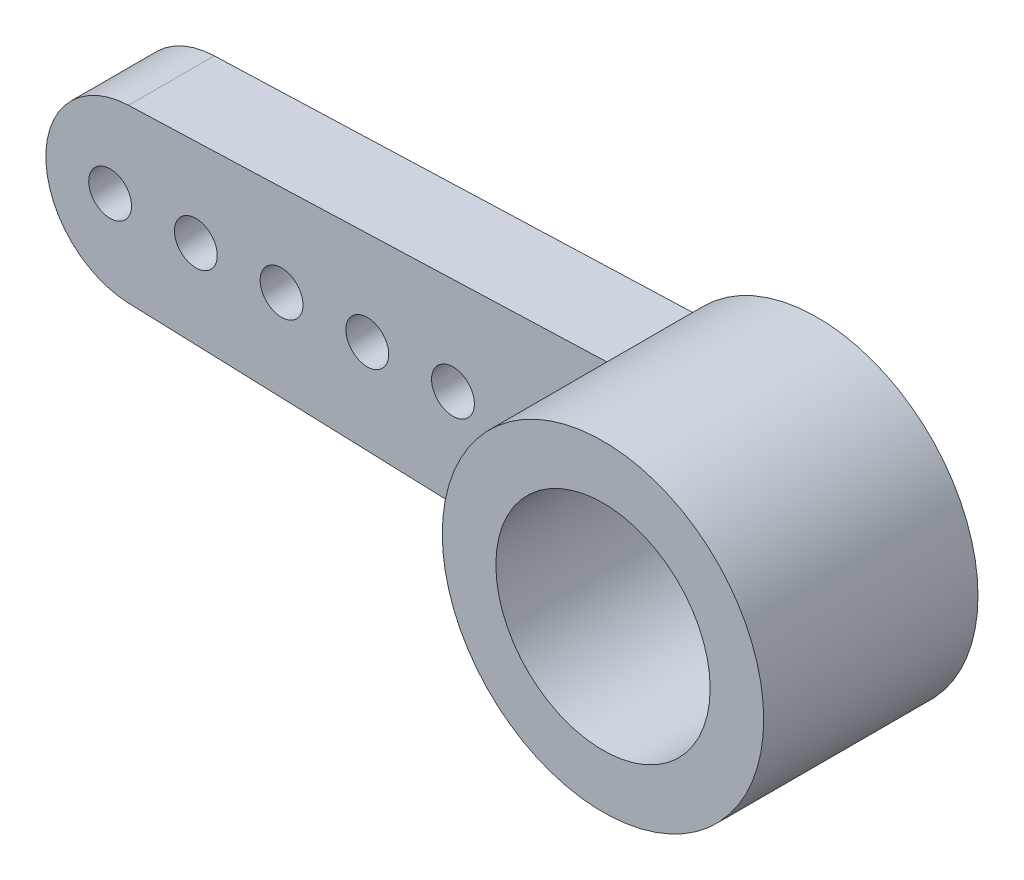
ISO-10303-21;
HEADER;
FILE_DESCRIPTION(('STEP AP214'),'2;1');
FILE_NAME('part.step','',(''),(''),'','','');
FILE_SCHEMA(('AUTOMOTIVE_DESIGN { 1 0 10303 214 1 1 1 1 }'));
ENDSEC;
DATA;
#1=APPLICATION_CONTEXT('core data for automotive mechanical design processes');
#2=APPLICATION_PROTOCOL_DEFINITION('international standard','automotive_design',2000,#1);
#3=PRODUCT_CONTEXT('',#1,'mechanical');
#4=PRODUCT('Part','Part','',(#3));
#5=PRODUCT_RELATED_PRODUCT_CATEGORY('part','',(#4));
#6=PRODUCT_DEFINITION_FORMATION('','',#4);
#7=PRODUCT_DEFINITION_CONTEXT('part definition',#1,'design');
#8=PRODUCT_DEFINITION('design','',#6,#7);
#9=PRODUCT_DEFINITION_SHAPE('','',#8);
#10=(LENGTH_UNIT() NAMED_UNIT(*) SI_UNIT(.MILLI.,.METRE.));
#11=(NAMED_UNIT(*) PLANE_ANGLE_UNIT() SI_UNIT($,.RADIAN.));
#12=(NAMED_UNIT(*) SI_UNIT($,.STERADIAN.) SOLID_ANGLE_UNIT());
#13=UNCERTAINTY_MEASURE_WITH_UNIT(LENGTH_MEASURE(1.E-05),#10,'distance_accuracy_value','');
#14=(GEOMETRIC_REPRESENTATION_CONTEXT(3) GLOBAL_UNCERTAINTY_ASSIGNED_CONTEXT((#13)) GLOBAL_UNIT_ASSIGNED_CONTEXT((#10,
#11,#12)) REPRESENTATION_CONTEXT('',''));
#15=CARTESIAN_POINT('',(0.,0.,0.));
#16=DIRECTION('',(0.,0.,1.));
#17=DIRECTION('',(1.,0.,0.));
#18=AXIS2_PLACEMENT_3D('',#15,#16,#17);
#19=CARTESIAN_POINT('',(0.,0.,0.));
#20=DIRECTION('',(0.,0.,1.));
#21=DIRECTION('',(1.,0.,0.));
#22=AXIS2_PLACEMENT_3D('',#19,#20,#21);
#23=PLANE('',#22);
#24=CARTESIAN_POINT('',(-14.5,0.,0.));
#25=DIRECTION('',(0.,0.,-1.));
#26=DIRECTION('',(-1.,0.,0.));
#27=AXIS2_PLACEMENT_3D('',#24,#25,#26);
#28=CIRCLE('',#27,0.500000000000001);
#29=CARTESIAN_POINT('',(-15.,0.,0.));
#30=VERTEX_POINT('',#29);
#31=EDGE_CURVE('E164',#30,#30,#28,.F.);
#32=ORIENTED_EDGE('',*,*,#31,.T.);
#33=EDGE_LOOP('',(#32));
#34=FACE_BOUND('',#33,.T.);
#35=CARTESIAN_POINT('',(-10.5,0.,0.));
#36=DIRECTION('',(0.,0.,-1.));
#37=DIRECTION('',(-1.,0.,0.));
#38=AXIS2_PLACEMENT_3D('',#35,#36,#37);
#39=CIRCLE('',#38,0.500000000000001);
#40=CARTESIAN_POINT('',(-11.,0.,0.));
#41=VERTEX_POINT('',#40);
#42=EDGE_CURVE('E152',#41,#41,#39,.F.);
#43=ORIENTED_EDGE('',*,*,#42,.T.);
#44=EDGE_LOOP('',(#43));
#45=FACE_BOUND('',#44,.T.);
#46=CARTESIAN_POINT('',(-6.5,0.,0.));
#47=DIRECTION('',(0.,0.,-1.));
#48=DIRECTION('',(-1.,0.,0.));
#49=AXIS2_PLACEMENT_3D('',#46,#47,#48);
#50=CIRCLE('',#49,0.500000000000001);
#51=CARTESIAN_POINT('',(-7.,0.,0.));
#52=VERTEX_POINT('',#51);
#53=EDGE_CURVE('E140',#52,#52,#50,.F.);
#54=ORIENTED_EDGE('',*,*,#53,.T.);
#55=EDGE_LOOP('',(#54));
#56=FACE_BOUND('',#55,.T.);
#57=CARTESIAN_POINT('',(-4.5,0.,0.));
#58=DIRECTION('',(0.,0.,-1.));
#59=DIRECTION('',(-1.,0.,0.));
#60=AXIS2_PLACEMENT_3D('',#57,#58,#59);
#61=CIRCLE('',#60,0.500000000000001);
#62=CARTESIAN_POINT('',(-5.,0.,0.));
#63=VERTEX_POINT('',#62);
#64=EDGE_CURVE('E136',#63,#63,#61,.F.);
#65=ORIENTED_EDGE('',*,*,#64,.T.);
#66=EDGE_LOOP('',(#65));
#67=FACE_BOUND('',#66,.T.);
#68=CARTESIAN_POINT('',(-8.5,0.,0.));
#69=DIRECTION('',(0.,0.,-1.));
#70=DIRECTION('',(-1.,0.,0.));
#71=AXIS2_PLACEMENT_3D('',#68,#69,#70);
#72=CIRCLE('',#71,0.500000000000001);
#73=CARTESIAN_POINT('',(-9.,0.,0.));
#74=VERTEX_POINT('',#73);
#75=EDGE_CURVE('E146',#74,#74,#72,.F.);
#76=ORIENTED_EDGE('',*,*,#75,.T.);
#77=EDGE_LOOP('',(#76));
#78=FACE_BOUND('',#77,.T.);
#79=CARTESIAN_POINT('',(-12.5,0.,0.));
#80=DIRECTION('',(0.,0.,-1.));
#81=DIRECTION('',(-1.,0.,0.));
#82=AXIS2_PLACEMENT_3D('',#79,#80,#81);
#83=CIRCLE('',#82,0.500000000000001);
#84=CARTESIAN_POINT('',(-13.,0.,0.));
#85=VERTEX_POINT('',#84);
#86=EDGE_CURVE('E158',#85,#85,#83,.F.);
#87=ORIENTED_EDGE('',*,*,#86,.T.);
#88=EDGE_LOOP('',(#87));
#89=FACE_BOUND('',#88,.T.);
#90=CARTESIAN_POINT('',(0.,0.,0.));
#91=DIRECTION('',(0.,0.,-1.));
#92=DIRECTION('',(-1.,0.,0.));
#93=AXIS2_PLACEMENT_3D('',#90,#91,#92);
#94=CIRCLE('',#93,2.5);
#95=CARTESIAN_POINT('',(-2.5,0.,0.));
#96=VERTEX_POINT('',#95);
#97=EDGE_CURVE('E176',#96,#96,#94,.T.);
#98=ORIENTED_EDGE('',*,*,#97,.F.);
#99=EDGE_LOOP('',(#98));
#100=FACE_BOUND('',#99,.T.);
#101=DIRECTION('',(0.999372730394994,0.0354139201848026,0.));
#102=VECTOR('',#101,1.);
#103=CARTESIAN_POINT('',(-0.0883858807695831,2.49422934631706,0.));
#104=LINE('',#103,#102);
#105=CARTESIAN_POINT('',(-14.0708278403696,1.99874546078999,0.));
#106=VERTEX_POINT('',#105);
#107=CARTESIAN_POINT('',(-2.88547071027724,2.39511143376089,0.));
#108=VERTEX_POINT('',#107);
#109=EDGE_CURVE('E124',#106,#108,#104,.T.);
#110=ORIENTED_EDGE('',*,*,#109,.T.);
#111=CARTESIAN_POINT('',(0.,0.,0.));
#112=DIRECTION('',(0.,0.,-1.));
#113=DIRECTION('',(-1.,0.,0.));
#114=AXIS2_PLACEMENT_3D('',#111,#112,#113);
#115=CIRCLE('',#114,3.75);
#116=CARTESIAN_POINT('',(-2.88547071027724,-2.39511143376089,0.));
#117=VERTEX_POINT('',#116);
#118=EDGE_CURVE('E53',#108,#117,#115,.T.);
#119=ORIENTED_EDGE('',*,*,#118,.T.);
#120=DIRECTION('',(0.999372730394994,-0.0354139201848024,0.));
#121=VECTOR('',#120,1.);
#122=CARTESIAN_POINT('',(-0.0883858807695825,-2.49422934631706,0.));
#123=LINE('',#122,#121);
#124=CARTESIAN_POINT('',(-14.0708278403696,-1.99874546078999,0.));
#125=VERTEX_POINT('',#124);
#126=EDGE_CURVE('E105',#125,#117,#123,.T.);
#127=ORIENTED_EDGE('',*,*,#126,.F.);
#128=CARTESIAN_POINT('',(-14.,0.,0.));
#129=DIRECTION('',(0.,0.,1.));
#130=DIRECTION('',(1.,0.,0.));
#131=AXIS2_PLACEMENT_3D('',#128,#129,#130);
#132=CIRCLE('',#131,2.);
#133=EDGE_CURVE('E127',#125,#106,#132,.F.);
#134=ORIENTED_EDGE('',*,*,#133,.T.);
#135=EDGE_LOOP('',(#110,#119,#127,#134));
#136=FACE_BOUND('',#135,.T.);
#137=ADVANCED_FACE('F45',(#34,#45,#56,#67,#78,#89,#100,#136),#23,.F.);
#138=CARTESIAN_POINT('',(0.,0.,0.));
#139=DIRECTION('',(0.,0.,1.));
#140=DIRECTION('',(1.,0.,0.));
#141=AXIS2_PLACEMENT_3D('',#138,#139,#140);
#142=CYLINDRICAL_SURFACE('',#141,2.5);
#143=CARTESIAN_POINT('',(0.,0.,5.));
#144=DIRECTION('',(0.,0.,1.));
#145=DIRECTION('',(1.,0.,0.));
#146=AXIS2_PLACEMENT_3D('',#143,#144,#145);
#147=CIRCLE('',#146,2.5);
#148=CARTESIAN_POINT('',(2.5,0.,5.));
#149=VERTEX_POINT('',#148);
#150=EDGE_CURVE('E133',#149,#149,#147,.T.);
#151=ORIENTED_EDGE('',*,*,#150,.T.);
#152=EDGE_LOOP('',(#151));
#153=FACE_BOUND('',#152,.T.);
#154=CARTESIAN_POINT('',(0.,0.,1.));
#155=DIRECTION('',(0.,0.,-1.));
#156=DIRECTION('',(-1.,0.,0.));
#157=AXIS2_PLACEMENT_3D('',#154,#155,#156);
#158=CIRCLE('',#157,2.5);
#159=CARTESIAN_POINT('',(-2.5,0.,1.));
#160=VERTEX_POINT('',#159);
#161=EDGE_CURVE('E170',#160,#160,#158,.T.);
#162=ORIENTED_EDGE('',*,*,#161,.T.);
#163=EDGE_LOOP('',(#162));
#164=FACE_BOUND('',#163,.T.);
#165=ADVANCED_FACE('F206',(#153,#164),#142,.F.);
#166=CARTESIAN_POINT('',(0.,0.,2.));
#167=DIRECTION('',(0.,0.,1.));
#168=DIRECTION('',(1.,0.,0.));
#169=AXIS2_PLACEMENT_3D('',#166,#167,#168);
#170=PLANE('',#169);
#171=CARTESIAN_POINT('',(-12.5,0.,2.));
#172=DIRECTION('',(0.,0.,-1.));
#173=DIRECTION('',(-1.,0.,0.));
#174=AXIS2_PLACEMENT_3D('',#171,#172,#173);
#175=CIRCLE('',#174,0.500000000000001);
#176=CARTESIAN_POINT('',(-13.,0.,2.));
#177=VERTEX_POINT('',#176);
#178=EDGE_CURVE('E161',#177,#177,#175,.F.);
#179=ORIENTED_EDGE('',*,*,#178,.F.);
#180=EDGE_LOOP('',(#179));
#181=FACE_BOUND('',#180,.T.);
#182=CARTESIAN_POINT('',(-8.5,0.,2.));
#183=DIRECTION('',(0.,0.,-1.));
#184=DIRECTION('',(-1.,0.,0.));
#185=AXIS2_PLACEMENT_3D('',#182,#183,#184);
#186=CIRCLE('',#185,0.500000000000001);
#187=CARTESIAN_POINT('',(-9.,0.,2.));
#188=VERTEX_POINT('',#187);
#189=EDGE_CURVE('E149',#188,#188,#186,.F.);
#190=ORIENTED_EDGE('',*,*,#189,.F.);
#191=EDGE_LOOP('',(#190));
#192=FACE_BOUND('',#191,.T.);
#193=CARTESIAN_POINT('',(-4.5,0.,2.));
#194=DIRECTION('',(0.,0.,-1.));
#195=DIRECTION('',(-1.,0.,0.));
#196=AXIS2_PLACEMENT_3D('',#193,#194,#195);
#197=CIRCLE('',#196,0.500000000000001);
#198=CARTESIAN_POINT('',(-5.,0.,2.));
#199=VERTEX_POINT('',#198);
#200=EDGE_CURVE('E137',#199,#199,#197,.F.);
#201=ORIENTED_EDGE('',*,*,#200,.F.);
#202=EDGE_LOOP('',(#201));
#203=FACE_BOUND('',#202,.T.);
#204=CARTESIAN_POINT('',(0.,0.,2.));
#205=DIRECTION('',(0.,0.,1.));
#206=DIRECTION('',(1.,0.,0.));
#207=AXIS2_PLACEMENT_3D('',#204,#205,#206);
#208=CIRCLE('',#207,3.75);
#209=CARTESIAN_POINT('',(-2.88547071027724,2.39511143376089,2.));
#210=VERTEX_POINT('',#209);
#211=CARTESIAN_POINT('',(-2.88547071027724,-2.39511143376089,2.));
#212=VERTEX_POINT('',#211);
#213=EDGE_CURVE('E12',#210,#212,#208,.T.);
#214=ORIENTED_EDGE('',*,*,#213,.F.);
#215=DIRECTION('',(0.999372730394994,0.0354139201848026,0.));
#216=VECTOR('',#215,1.);
#217=CARTESIAN_POINT('',(-0.0883858807695831,2.49422934631706,2.));
#218=LINE('',#217,#216);
#219=CARTESIAN_POINT('',(-14.0708278403696,1.99874546078999,2.));
#220=VERTEX_POINT('',#219);
#221=EDGE_CURVE('E100',#220,#210,#218,.T.);
#222=ORIENTED_EDGE('',*,*,#221,.F.);
#223=CARTESIAN_POINT('',(-14.,0.,2.));
#224=DIRECTION('',(0.,0.,1.));
#225=DIRECTION('',(1.,0.,0.));
#226=AXIS2_PLACEMENT_3D('',#223,#224,#225);
#227=CIRCLE('',#226,2.);
#228=CARTESIAN_POINT('',(-14.0708278403696,-1.99874546078999,2.));
#229=VERTEX_POINT('',#228);
#230=EDGE_CURVE('E98',#229,#220,#227,.F.);
#231=ORIENTED_EDGE('',*,*,#230,.F.);
#232=DIRECTION('',(0.999372730394994,-0.0354139201848024,0.));
#233=VECTOR('',#232,1.);
#234=CARTESIAN_POINT('',(-0.0883858807695825,-2.49422934631706,2.));
#235=LINE('',#234,#233);
#236=EDGE_CURVE('E93',#229,#212,#235,.T.);
#237=ORIENTED_EDGE('',*,*,#236,.T.);
#238=EDGE_LOOP('',(#214,#222,#231,#237));
#239=FACE_BOUND('',#238,.T.);
#240=CARTESIAN_POINT('',(-6.5,0.,2.));
#241=DIRECTION('',(0.,0.,-1.));
#242=DIRECTION('',(-1.,0.,0.));
#243=AXIS2_PLACEMENT_3D('',#240,#241,#242);
#244=CIRCLE('',#243,0.500000000000001);
#245=CARTESIAN_POINT('',(-7.,0.,2.));
#246=VERTEX_POINT('',#245);
#247=EDGE_CURVE('E143',#246,#246,#244,.F.);
#248=ORIENTED_EDGE('',*,*,#247,.F.);
#249=EDGE_LOOP('',(#248));
#250=FACE_BOUND('',#249,.T.);
#251=CARTESIAN_POINT('',(-10.5,0.,2.));
#252=DIRECTION('',(0.,0.,-1.));
#253=DIRECTION('',(-1.,0.,0.));
#254=AXIS2_PLACEMENT_3D('',#251,#252,#253);
#255=CIRCLE('',#254,0.500000000000001);
#256=CARTESIAN_POINT('',(-11.,0.,2.));
#257=VERTEX_POINT('',#256);
#258=EDGE_CURVE('E155',#257,#257,#255,.F.);
#259=ORIENTED_EDGE('',*,*,#258,.F.);
#260=EDGE_LOOP('',(#259));
#261=FACE_BOUND('',#260,.T.);
#262=CARTESIAN_POINT('',(-14.5,0.,2.));
#263=DIRECTION('',(0.,0.,-1.));
#264=DIRECTION('',(-1.,0.,0.));
#265=AXIS2_PLACEMENT_3D('',#262,#263,#264);
#266=CIRCLE('',#265,0.500000000000001);
#267=CARTESIAN_POINT('',(-15.,0.,2.));
#268=VERTEX_POINT('',#267);
#269=EDGE_CURVE('E167',#268,#268,#266,.F.);
#270=ORIENTED_EDGE('',*,*,#269,.F.);
#271=EDGE_LOOP('',(#270));
#272=FACE_BOUND('',#271,.T.);
#273=ADVANCED_FACE('F95',(#181,#192,#203,#239,#250,#261,#272),#170,.T.);
#274=CARTESIAN_POINT('',(0.,0.,0.));
#275=DIRECTION('',(0.,0.,1.));
#276=DIRECTION('',(1.,0.,0.));
#277=AXIS2_PLACEMENT_3D('',#274,#275,#276);
#278=CYLINDRICAL_SURFACE('',#277,3.75);
#279=ORIENTED_EDGE('',*,*,#118,.F.);
#280=DIRECTION('',(0.,0.,-1.));
#281=VECTOR('',#280,1.);
#282=CARTESIAN_POINT('',(-2.88547071027724,2.39511143376089,2.));
#283=LINE('',#282,#281);
#284=EDGE_CURVE('E106',#210,#108,#283,.T.);
#285=ORIENTED_EDGE('',*,*,#284,.F.);
#286=ORIENTED_EDGE('',*,*,#213,.T.);
#287=DIRECTION('',(0.,0.,-1.));
#288=VECTOR('',#287,1.);
#289=CARTESIAN_POINT('',(-2.88547071027724,-2.39511143376089,2.));
#290=LINE('',#289,#288);
#291=EDGE_CURVE('E102',#212,#117,#290,.T.);
#292=ORIENTED_EDGE('',*,*,#291,.T.);
#293=EDGE_LOOP('',(#279,#285,#286,#292));
#294=FACE_BOUND('',#293,.T.);
#295=CARTESIAN_POINT('',(0.,0.,5.));
#296=DIRECTION('',(0.,0.,1.));
#297=DIRECTION('',(1.,0.,0.));
#298=AXIS2_PLACEMENT_3D('',#295,#296,#297);
#299=CIRCLE('',#298,3.75);
#300=CARTESIAN_POINT('',(3.75,0.,5.));
#301=VERTEX_POINT('',#300);
#302=EDGE_CURVE('E129',#301,#301,#299,.T.);
#303=ORIENTED_EDGE('',*,*,#302,.F.);
#304=EDGE_LOOP('',(#303));
#305=FACE_BOUND('',#304,.T.);
#306=ADVANCED_FACE('F108',(#294,#305),#278,.T.);
#307=CARTESIAN_POINT('',(-14.,0.,2.));
#308=DIRECTION('',(0.,0.,-1.));
#309=DIRECTION('',(-1.,0.,0.));
#310=AXIS2_PLACEMENT_3D('',#307,#308,#309);
#311=CYLINDRICAL_SURFACE('',#310,2.);
#312=ORIENTED_EDGE('',*,*,#133,.F.);
#313=DIRECTION('',(0.,0.,-1.));
#314=VECTOR('',#313,1.);
#315=CARTESIAN_POINT('',(-14.0708278403696,-1.99874546078999,2.));
#316=LINE('',#315,#314);
#317=EDGE_CURVE('E88',#229,#125,#316,.T.);
#318=ORIENTED_EDGE('',*,*,#317,.F.);
#319=ORIENTED_EDGE('',*,*,#230,.T.);
#320=DIRECTION('',(0.,0.,-1.));
#321=VECTOR('',#320,1.);
#322=CARTESIAN_POINT('',(-14.0708278403696,1.99874546078999,2.));
#323=LINE('',#322,#321);
#324=EDGE_CURVE('E69',#220,#106,#323,.T.);
#325=ORIENTED_EDGE('',*,*,#324,.T.);
#326=EDGE_LOOP('',(#312,#318,#319,#325));
#327=FACE_BOUND('',#326,.T.);
#328=ADVANCED_FACE('F220',(#327),#311,.T.);
#329=CARTESIAN_POINT('',(-0.0883858807695825,-2.49422934631706,2.));
#330=DIRECTION('',(0.0354139201848024,0.999372730394994,0.));
#331=DIRECTION('',(-0.999372730394994,0.0354139201848024,0.));
#332=AXIS2_PLACEMENT_3D('',#329,#330,#331);
#333=PLANE('',#332);
#334=ORIENTED_EDGE('',*,*,#126,.T.);
#335=ORIENTED_EDGE('',*,*,#291,.F.);
#336=ORIENTED_EDGE('',*,*,#236,.F.);
#337=ORIENTED_EDGE('',*,*,#317,.T.);
#338=EDGE_LOOP('',(#334,#335,#336,#337));
#339=FACE_BOUND('',#338,.T.);
#340=ADVANCED_FACE('F103',(#339),#333,.F.);
#341=CARTESIAN_POINT('',(-0.0883858807695831,2.49422934631706,2.));
#342=DIRECTION('',(-0.0354139201848026,0.999372730394994,0.));
#343=DIRECTION('',(-0.999372730394994,-0.0354139201848026,0.));
#344=AXIS2_PLACEMENT_3D('',#341,#342,#343);
#345=PLANE('',#344);
#346=ORIENTED_EDGE('',*,*,#109,.F.);
#347=ORIENTED_EDGE('',*,*,#324,.F.);
#348=ORIENTED_EDGE('',*,*,#221,.T.);
#349=ORIENTED_EDGE('',*,*,#284,.T.);
#350=EDGE_LOOP('',(#346,#347,#348,#349));
#351=FACE_BOUND('',#350,.T.);
#352=ADVANCED_FACE('F208',(#351),#345,.T.);
#353=CARTESIAN_POINT('',(0.,0.,5.));
#354=DIRECTION('',(0.,0.,1.));
#355=DIRECTION('',(1.,0.,0.));
#356=AXIS2_PLACEMENT_3D('',#353,#354,#355);
#357=PLANE('',#356);
#358=ORIENTED_EDGE('',*,*,#302,.T.);
#359=EDGE_LOOP('',(#358));
#360=FACE_BOUND('',#359,.T.);
#361=ORIENTED_EDGE('',*,*,#150,.F.);
#362=EDGE_LOOP('',(#361));
#363=FACE_BOUND('',#362,.T.);
#364=ADVANCED_FACE('F210',(#360,#363),#357,.T.);
#365=CARTESIAN_POINT('',(-4.5,0.,2.));
#366=DIRECTION('',(0.,0.,-1.));
#367=DIRECTION('',(-1.,0.,0.));
#368=AXIS2_PLACEMENT_3D('',#365,#366,#367);
#369=CYLINDRICAL_SURFACE('',#368,0.500000000000001);
#370=ORIENTED_EDGE('',*,*,#200,.T.);
#371=EDGE_LOOP('',(#370));
#372=FACE_BOUND('',#371,.T.);
#373=ORIENTED_EDGE('',*,*,#64,.F.);
#374=EDGE_LOOP('',(#373));
#375=FACE_BOUND('',#374,.T.);
#376=ADVANCED_FACE('F217',(#372,#375),#369,.F.);
#377=CARTESIAN_POINT('',(-6.5,0.,2.));
#378=DIRECTION('',(0.,0.,-1.));
#379=DIRECTION('',(-1.,0.,0.));
#380=AXIS2_PLACEMENT_3D('',#377,#378,#379);
#381=CYLINDRICAL_SURFACE('',#380,0.500000000000001);
#382=ORIENTED_EDGE('',*,*,#247,.T.);
#383=EDGE_LOOP('',(#382));
#384=FACE_BOUND('',#383,.T.);
#385=ORIENTED_EDGE('',*,*,#53,.F.);
#386=EDGE_LOOP('',(#385));
#387=FACE_BOUND('',#386,.T.);
#388=ADVANCED_FACE('F241',(#384,#387),#381,.F.);
#389=CARTESIAN_POINT('',(-8.5,0.,2.));
#390=DIRECTION('',(0.,0.,-1.));
#391=DIRECTION('',(-1.,0.,0.));
#392=AXIS2_PLACEMENT_3D('',#389,#390,#391);
#393=CYLINDRICAL_SURFACE('',#392,0.500000000000001);
#394=ORIENTED_EDGE('',*,*,#189,.T.);
#395=EDGE_LOOP('',(#394));
#396=FACE_BOUND('',#395,.T.);
#397=ORIENTED_EDGE('',*,*,#75,.F.);
#398=EDGE_LOOP('',(#397));
#399=FACE_BOUND('',#398,.T.);
#400=ADVANCED_FACE('F261',(#396,#399),#393,.F.);
#401=CARTESIAN_POINT('',(-10.5,0.,2.));
#402=DIRECTION('',(0.,0.,-1.));
#403=DIRECTION('',(-1.,0.,0.));
#404=AXIS2_PLACEMENT_3D('',#401,#402,#403);
#405=CYLINDRICAL_SURFACE('',#404,0.500000000000001);
#406=ORIENTED_EDGE('',*,*,#258,.T.);
#407=EDGE_LOOP('',(#406));
#408=FACE_BOUND('',#407,.T.);
#409=ORIENTED_EDGE('',*,*,#42,.F.);
#410=EDGE_LOOP('',(#409));
#411=FACE_BOUND('',#410,.T.);
#412=ADVANCED_FACE('F252',(#408,#411),#405,.F.);
#413=CARTESIAN_POINT('',(-12.5,0.,2.));
#414=DIRECTION('',(0.,0.,-1.));
#415=DIRECTION('',(-1.,0.,0.));
#416=AXIS2_PLACEMENT_3D('',#413,#414,#415);
#417=CYLINDRICAL_SURFACE('',#416,0.500000000000001);
#418=ORIENTED_EDGE('',*,*,#178,.T.);
#419=EDGE_LOOP('',(#418));
#420=FACE_BOUND('',#419,.T.);
#421=ORIENTED_EDGE('',*,*,#86,.F.);
#422=EDGE_LOOP('',(#421));
#423=FACE_BOUND('',#422,.T.);
#424=ADVANCED_FACE('F249',(#420,#423),#417,.F.);
#425=CARTESIAN_POINT('',(-14.5,0.,2.));
#426=DIRECTION('',(0.,0.,-1.));
#427=DIRECTION('',(-1.,0.,0.));
#428=AXIS2_PLACEMENT_3D('',#425,#426,#427);
#429=CYLINDRICAL_SURFACE('',#428,0.500000000000001);
#430=ORIENTED_EDGE('',*,*,#269,.T.);
#431=EDGE_LOOP('',(#430));
#432=FACE_BOUND('',#431,.T.);
#433=ORIENTED_EDGE('',*,*,#31,.F.);
#434=EDGE_LOOP('',(#433));
#435=FACE_BOUND('',#434,.T.);
#436=ADVANCED_FACE('F251',(#432,#435),#429,.F.);
#437=CARTESIAN_POINT('',(0.,0.,1.));
#438=DIRECTION('',(0.,0.,-1.));
#439=DIRECTION('',(-1.,0.,0.));
#440=AXIS2_PLACEMENT_3D('',#437,#438,#439);
#441=PLANE('',#440);
#442=CARTESIAN_POINT('',(0.,0.,1.));
#443=DIRECTION('',(0.,0.,-1.));
#444=DIRECTION('',(-1.,0.,0.));
#445=AXIS2_PLACEMENT_3D('',#442,#443,#444);
#446=CIRCLE('',#445,1.25);
#447=CARTESIAN_POINT('',(-1.25,0.,1.));
#448=VERTEX_POINT('',#447);
#449=EDGE_CURVE('E179',#448,#448,#446,.T.);
#450=ORIENTED_EDGE('',*,*,#449,.T.);
#451=EDGE_LOOP('',(#450));
#452=FACE_BOUND('',#451,.T.);
#453=ORIENTED_EDGE('',*,*,#161,.F.);
#454=EDGE_LOOP('',(#453));
#455=FACE_BOUND('',#454,.T.);
#456=ADVANCED_FACE('F200',(#452,#455),#441,.F.);
#457=CARTESIAN_POINT('',(0.,0.,0.5));
#458=DIRECTION('',(0.,0.,-1.));
#459=DIRECTION('',(-1.,0.,0.));
#460=AXIS2_PLACEMENT_3D('',#457,#458,#459);
#461=CYLINDRICAL_SURFACE('',#460,2.5);
#462=CARTESIAN_POINT('',(0.,0.,0.5));
#463=DIRECTION('',(0.,0.,-1.));
#464=DIRECTION('',(-1.,0.,0.));
#465=AXIS2_PLACEMENT_3D('',#462,#463,#464);
#466=CIRCLE('',#465,2.5);
#467=CARTESIAN_POINT('',(-2.5,0.,0.5));
#468=VERTEX_POINT('',#467);
#469=EDGE_CURVE('E175',#468,#468,#466,.T.);
#470=ORIENTED_EDGE('',*,*,#469,.F.);
#471=EDGE_LOOP('',(#470));
#472=FACE_BOUND('',#471,.T.);
#473=ORIENTED_EDGE('',*,*,#97,.T.);
#474=EDGE_LOOP('',(#473));
#475=FACE_BOUND('',#474,.T.);
#476=ADVANCED_FACE('F194',(#472,#475),#461,.F.);
#477=CARTESIAN_POINT('',(0.,0.,0.5));
#478=DIRECTION('',(0.,0.,-1.));
#479=DIRECTION('',(-1.,0.,0.));
#480=AXIS2_PLACEMENT_3D('',#477,#478,#479);
#481=PLANE('',#480);
#482=CARTESIAN_POINT('',(0.,0.,0.5));
#483=DIRECTION('',(0.,0.,-1.));
#484=DIRECTION('',(-1.,0.,0.));
#485=AXIS2_PLACEMENT_3D('',#482,#483,#484);
#486=CIRCLE('',#485,1.25);
#487=CARTESIAN_POINT('',(-1.25,0.,0.5));
#488=VERTEX_POINT('',#487);
#489=EDGE_CURVE('E184',#488,#488,#486,.T.);
#490=ORIENTED_EDGE('',*,*,#489,.F.);
#491=EDGE_LOOP('',(#490));
#492=FACE_BOUND('',#491,.T.);
#493=ORIENTED_EDGE('',*,*,#469,.T.);
#494=EDGE_LOOP('',(#493));
#495=FACE_BOUND('',#494,.T.);
#496=ADVANCED_FACE('F191',(#492,#495),#481,.T.);
#497=CARTESIAN_POINT('',(0.,0.,5.5));
#498=DIRECTION('',(0.,0.,-1.));
#499=DIRECTION('',(-1.,0.,0.));
#500=AXIS2_PLACEMENT_3D('',#497,#498,#499);
#501=CYLINDRICAL_SURFACE('',#500,1.25);
#502=ORIENTED_EDGE('',*,*,#489,.T.);
#503=EDGE_LOOP('',(#502));
#504=FACE_BOUND('',#503,.T.);
#505=ORIENTED_EDGE('',*,*,#449,.F.);
#506=EDGE_LOOP('',(#505));
#507=FACE_BOUND('',#506,.T.);
#508=ADVANCED_FACE('F188',(#504,#507),#501,.F.);
#509=CLOSED_SHELL('',(#137,#165,#273,#306,#328,#340,#352,#364,#376,#388,#400,#412,#424,#436,
#456,#476,#496,#508));
#510=MANIFOLD_SOLID_BREP('B2',#509);
#511=ADVANCED_BREP_SHAPE_REPRESENTATION('',(#18,#510),#14);
#512=SHAPE_DEFINITION_REPRESENTATION(#9,#511);
ENDSEC;
END-ISO-10303-21;
